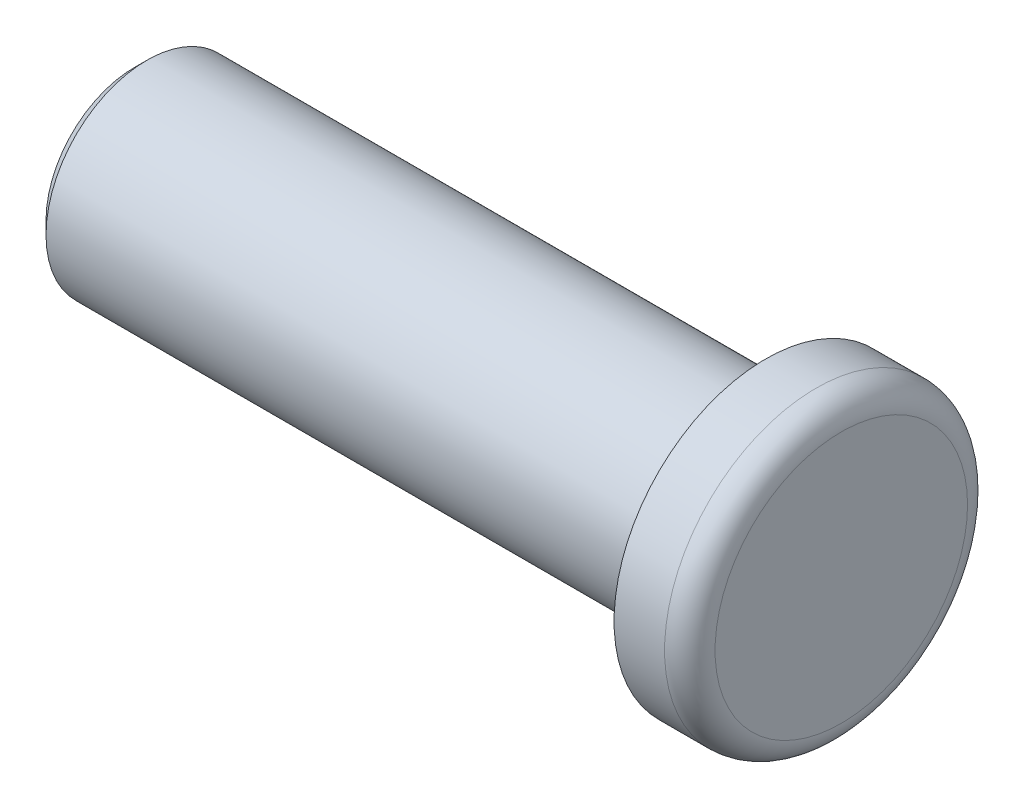
ISO-10303-21;
HEADER;
FILE_DESCRIPTION(('STEP AP214'),'2;1');
FILE_NAME('part.step','',(''),(''),'','','');
FILE_SCHEMA(('AUTOMOTIVE_DESIGN { 1 0 10303 214 1 1 1 1 }'));
ENDSEC;
DATA;
#1=APPLICATION_CONTEXT('core data for automotive mechanical design processes');
#2=APPLICATION_PROTOCOL_DEFINITION('international standard','automotive_design',2000,#1);
#3=PRODUCT_CONTEXT('',#1,'mechanical');
#4=PRODUCT('Part','Part','',(#3));
#5=PRODUCT_RELATED_PRODUCT_CATEGORY('part','',(#4));
#6=PRODUCT_DEFINITION_FORMATION('','',#4);
#7=PRODUCT_DEFINITION_CONTEXT('part definition',#1,'design');
#8=PRODUCT_DEFINITION('design','',#6,#7);
#9=PRODUCT_DEFINITION_SHAPE('','',#8);
#10=(LENGTH_UNIT() NAMED_UNIT(*) SI_UNIT(.MILLI.,.METRE.));
#11=(NAMED_UNIT(*) PLANE_ANGLE_UNIT() SI_UNIT($,.RADIAN.));
#12=(NAMED_UNIT(*) SI_UNIT($,.STERADIAN.) SOLID_ANGLE_UNIT());
#13=UNCERTAINTY_MEASURE_WITH_UNIT(LENGTH_MEASURE(1.E-05),#10,'distance_accuracy_value','');
#14=(GEOMETRIC_REPRESENTATION_CONTEXT(3) GLOBAL_UNCERTAINTY_ASSIGNED_CONTEXT((#13)) GLOBAL_UNIT_ASSIGNED_CONTEXT((#10,
#11,#12)) REPRESENTATION_CONTEXT('',''));
#15=CARTESIAN_POINT('',(0.,0.,0.));
#16=DIRECTION('',(0.,0.,1.));
#17=DIRECTION('',(1.,0.,0.));
#18=AXIS2_PLACEMENT_3D('',#15,#16,#17);
#19=CARTESIAN_POINT('',(3.,0.,0.));
#20=DIRECTION('',(-1.,0.,0.));
#21=DIRECTION('',(0.,0.,1.));
#22=AXIS2_PLACEMENT_3D('',#19,#20,#21);
#23=CYLINDRICAL_SURFACE('',#22,6.);
#24=CARTESIAN_POINT('',(2.,0.,0.));
#25=DIRECTION('',(1.,0.,0.));
#26=DIRECTION('',(0.,0.,-1.));
#27=AXIS2_PLACEMENT_3D('',#24,#25,#26);
#28=CIRCLE('',#27,6.);
#29=CARTESIAN_POINT('',(2.,0.,-6.));
#30=VERTEX_POINT('',#29);
#31=EDGE_CURVE('E59',#30,#30,#28,.F.);
#32=ORIENTED_EDGE('',*,*,#31,.T.);
#33=EDGE_LOOP('',(#32));
#34=FACE_BOUND('',#33,.T.);
#35=CARTESIAN_POINT('',(0.,0.,0.));
#36=DIRECTION('',(1.,0.,0.));
#37=DIRECTION('',(0.,0.,-1.));
#38=AXIS2_PLACEMENT_3D('',#35,#36,#37);
#39=CIRCLE('',#38,6.);
#40=CARTESIAN_POINT('',(0.,0.,-6.));
#41=VERTEX_POINT('',#40);
#42=EDGE_CURVE('E71',#41,#41,#39,.T.);
#43=ORIENTED_EDGE('',*,*,#42,.T.);
#44=EDGE_LOOP('',(#43));
#45=FACE_BOUND('',#44,.T.);
#46=ADVANCED_FACE('F45',(#34,#45),#23,.T.);
#47=CARTESIAN_POINT('',(3.,0.,0.));
#48=DIRECTION('',(1.,0.,0.));
#49=DIRECTION('',(0.,0.,-1.));
#50=AXIS2_PLACEMENT_3D('',#47,#48,#49);
#51=PLANE('',#50);
#52=CARTESIAN_POINT('',(3.,0.,0.));
#53=DIRECTION('',(1.,0.,0.));
#54=DIRECTION('',(0.,0.,-1.));
#55=AXIS2_PLACEMENT_3D('',#52,#53,#54);
#56=CIRCLE('',#55,5.);
#57=CARTESIAN_POINT('',(3.,0.,-5.));
#58=VERTEX_POINT('',#57);
#59=EDGE_CURVE('E64',#58,#58,#56,.T.);
#60=ORIENTED_EDGE('',*,*,#59,.T.);
#61=EDGE_LOOP('',(#60));
#62=FACE_BOUND('',#61,.T.);
#63=ADVANCED_FACE('F84',(#62),#51,.T.);
#64=CARTESIAN_POINT('',(0.,0.,0.));
#65=DIRECTION('',(1.,0.,0.));
#66=DIRECTION('',(0.,0.,-1.));
#67=AXIS2_PLACEMENT_3D('',#64,#65,#66);
#68=PLANE('',#67);
#69=CARTESIAN_POINT('',(0.,0.,0.));
#70=DIRECTION('',(-1.,0.,0.));
#71=DIRECTION('',(0.,0.,1.));
#72=AXIS2_PLACEMENT_3D('',#69,#70,#71);
#73=CIRCLE('',#72,4.);
#74=CARTESIAN_POINT('',(0.,0.,4.));
#75=VERTEX_POINT('',#74);
#76=EDGE_CURVE('E70',#75,#75,#73,.T.);
#77=ORIENTED_EDGE('',*,*,#76,.F.);
#78=EDGE_LOOP('',(#77));
#79=FACE_BOUND('',#78,.T.);
#80=ORIENTED_EDGE('',*,*,#42,.F.);
#81=EDGE_LOOP('',(#80));
#82=FACE_BOUND('',#81,.T.);
#83=ADVANCED_FACE('F81',(#79,#82),#68,.F.);
#84=CARTESIAN_POINT('',(-25.,0.,0.));
#85=DIRECTION('',(1.,0.,0.));
#86=DIRECTION('',(0.,0.,-1.));
#87=AXIS2_PLACEMENT_3D('',#84,#85,#86);
#88=CYLINDRICAL_SURFACE('',#87,4.);
#89=CARTESIAN_POINT('',(-24.5,0.,0.));
#90=DIRECTION('',(-1.,0.,0.));
#91=DIRECTION('',(0.,0.,1.));
#92=AXIS2_PLACEMENT_3D('',#89,#90,#91);
#93=CIRCLE('',#92,4.);
#94=CARTESIAN_POINT('',(-24.5,0.,4.));
#95=VERTEX_POINT('',#94);
#96=EDGE_CURVE('E10',#95,#95,#93,.F.);
#97=ORIENTED_EDGE('',*,*,#96,.T.);
#98=EDGE_LOOP('',(#97));
#99=FACE_BOUND('',#98,.T.);
#100=ORIENTED_EDGE('',*,*,#76,.T.);
#101=EDGE_LOOP('',(#100));
#102=FACE_BOUND('',#101,.T.);
#103=ADVANCED_FACE('F79',(#99,#102),#88,.T.);
#104=CARTESIAN_POINT('',(-25.,0.,0.));
#105=DIRECTION('',(-1.,0.,0.));
#106=DIRECTION('',(0.,0.,1.));
#107=AXIS2_PLACEMENT_3D('',#104,#105,#106);
#108=PLANE('',#107);
#109=CARTESIAN_POINT('',(-25.,0.,0.));
#110=DIRECTION('',(-1.,0.,0.));
#111=DIRECTION('',(0.,0.,1.));
#112=AXIS2_PLACEMENT_3D('',#109,#110,#111);
#113=CIRCLE('',#112,3.50000000000001);
#114=CARTESIAN_POINT('',(-25.,0.,3.50000000000001));
#115=VERTEX_POINT('',#114);
#116=EDGE_CURVE('E54',#115,#115,#113,.T.);
#117=ORIENTED_EDGE('',*,*,#116,.T.);
#118=EDGE_LOOP('',(#117));
#119=FACE_BOUND('',#118,.T.);
#120=ADVANCED_FACE('F98',(#119),#108,.T.);
#121=CARTESIAN_POINT('',(2.,0.,0.));
#122=DIRECTION('',(1.,0.,0.));
#123=DIRECTION('',(0.,0.,-1.));
#124=AXIS2_PLACEMENT_3D('',#121,#122,#123);
#125=TOROIDAL_SURFACE('',#124,5.,1.);
#126=ORIENTED_EDGE('',*,*,#31,.F.);
#127=EDGE_LOOP('',(#126));
#128=FACE_BOUND('',#127,.T.);
#129=ORIENTED_EDGE('',*,*,#59,.F.);
#130=EDGE_LOOP('',(#129));
#131=FACE_BOUND('',#130,.T.);
#132=ADVANCED_FACE('F96',(#128,#131),#125,.T.);
#133=CARTESIAN_POINT('',(-25.,0.,0.));
#134=DIRECTION('',(1.,0.,0.));
#135=DIRECTION('',(0.,0.,-1.));
#136=AXIS2_PLACEMENT_3D('',#133,#134,#135);
#137=CONICAL_SURFACE('',#136,3.50000000000001,0.785398163397445);
#138=ORIENTED_EDGE('',*,*,#96,.F.);
#139=EDGE_LOOP('',(#138));
#140=FACE_BOUND('',#139,.T.);
#141=ORIENTED_EDGE('',*,*,#116,.F.);
#142=EDGE_LOOP('',(#141));
#143=FACE_BOUND('',#142,.T.);
#144=ADVANCED_FACE('F48',(#140,#143),#137,.T.);
#145=CLOSED_SHELL('',(#46,#63,#83,#103,#120,#132,#144));
#146=MANIFOLD_SOLID_BREP('B2',#145);
#147=ADVANCED_BREP_SHAPE_REPRESENTATION('',(#18,#146),#14);
#148=SHAPE_DEFINITION_REPRESENTATION(#9,#147);
ENDSEC;
END-ISO-10303-21;
